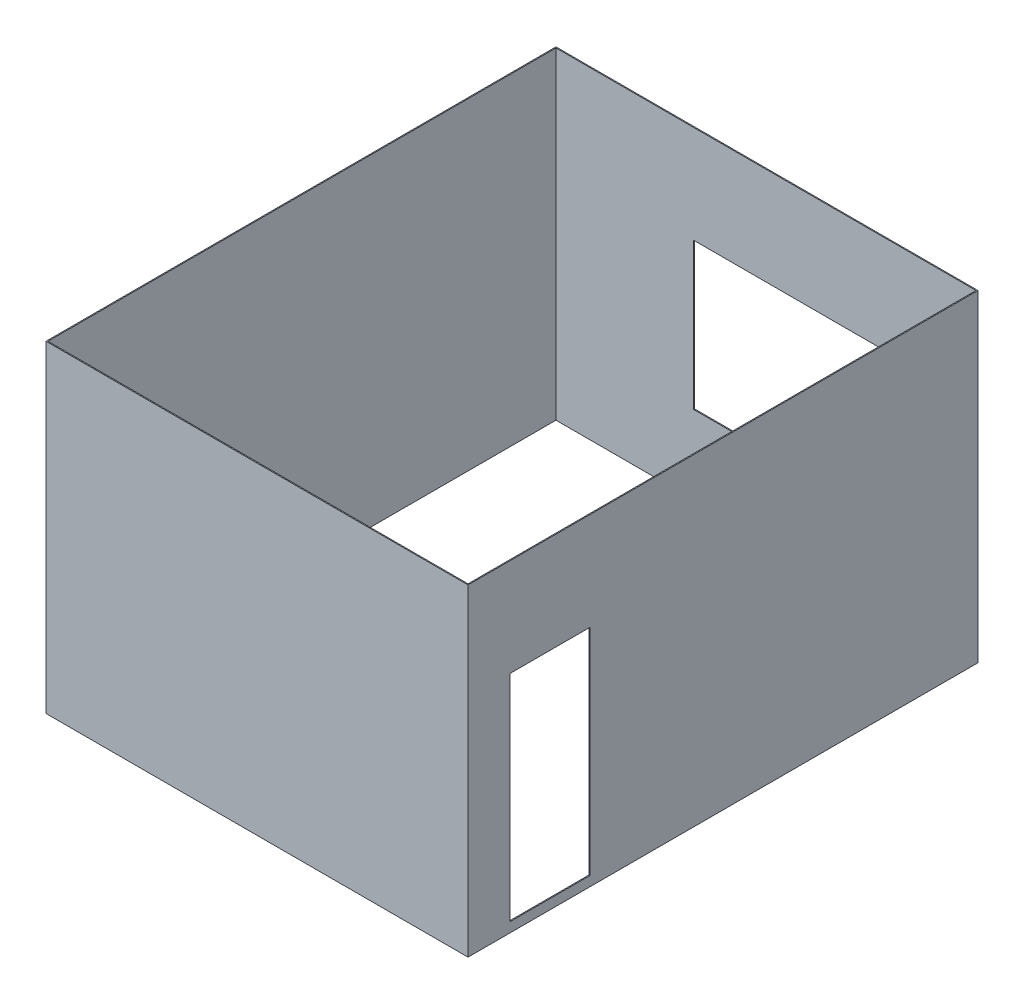
ISO-10303-21;
HEADER;
FILE_DESCRIPTION(('STEP AP214'),'2;1');
FILE_NAME('part.step','',(''),(''),'','','');
FILE_SCHEMA(('AUTOMOTIVE_DESIGN { 1 0 10303 214 1 1 1 1 }'));
ENDSEC;
DATA;
#1=APPLICATION_CONTEXT('core data for automotive mechanical design processes');
#2=APPLICATION_PROTOCOL_DEFINITION('international standard','automotive_design',2000,#1);
#3=PRODUCT_CONTEXT('',#1,'mechanical');
#4=PRODUCT('Part','Part','',(#3));
#5=PRODUCT_RELATED_PRODUCT_CATEGORY('part','',(#4));
#6=PRODUCT_DEFINITION_FORMATION('','',#4);
#7=PRODUCT_DEFINITION_CONTEXT('part definition',#1,'design');
#8=PRODUCT_DEFINITION('design','',#6,#7);
#9=PRODUCT_DEFINITION_SHAPE('','',#8);
#10=(LENGTH_UNIT() NAMED_UNIT(*) SI_UNIT(.MILLI.,.METRE.));
#11=(NAMED_UNIT(*) PLANE_ANGLE_UNIT() SI_UNIT($,.RADIAN.));
#12=(NAMED_UNIT(*) SI_UNIT($,.STERADIAN.) SOLID_ANGLE_UNIT());
#13=UNCERTAINTY_MEASURE_WITH_UNIT(LENGTH_MEASURE(1.E-05),#10,'distance_accuracy_value','');
#14=(GEOMETRIC_REPRESENTATION_CONTEXT(3) GLOBAL_UNCERTAINTY_ASSIGNED_CONTEXT((#13)) GLOBAL_UNIT_ASSIGNED_CONTEXT((#10,
#11,#12)) REPRESENTATION_CONTEXT('',''));
#15=CARTESIAN_POINT('',(0.,0.,0.));
#16=DIRECTION('',(0.,0.,1.));
#17=DIRECTION('',(1.,0.,0.));
#18=AXIS2_PLACEMENT_3D('',#15,#16,#17);
#19=CARTESIAN_POINT('',(0.,330.,0.));
#20=DIRECTION('',(0.,1.,0.));
#21=DIRECTION('',(0.,0.,1.));
#22=AXIS2_PLACEMENT_3D('',#19,#20,#21);
#23=PLANE('',#22);
#24=DIRECTION('',(0.,0.,-1.));
#25=VECTOR('',#24,1.);
#26=CARTESIAN_POINT('',(1.,330.,0.));
#27=LINE('',#26,#25);
#28=CARTESIAN_POINT('',(1.,330.,1.));
#29=VERTEX_POINT('',#28);
#30=CARTESIAN_POINT('',(1.,330.,-521.));
#31=VERTEX_POINT('',#30);
#32=EDGE_CURVE('E251',#29,#31,#27,.T.);
#33=ORIENTED_EDGE('',*,*,#32,.T.);
#34=DIRECTION('',(-1.,0.,0.));
#35=VECTOR('',#34,1.);
#36=CARTESIAN_POINT('',(0.,330.,-521.));
#37=LINE('',#36,#35);
#38=CARTESIAN_POINT('',(-431.,330.,-521.));
#39=VERTEX_POINT('',#38);
#40=EDGE_CURVE('E254',#31,#39,#37,.T.);
#41=ORIENTED_EDGE('',*,*,#40,.T.);
#42=DIRECTION('',(0.,0.,1.));
#43=VECTOR('',#42,1.);
#44=CARTESIAN_POINT('',(-431.,330.,0.));
#45=LINE('',#44,#43);
#46=CARTESIAN_POINT('',(-431.,330.,1.00000000000005));
#47=VERTEX_POINT('',#46);
#48=EDGE_CURVE('E257',#39,#47,#45,.T.);
#49=ORIENTED_EDGE('',*,*,#48,.T.);
#50=DIRECTION('',(1.,0.,0.));
#51=VECTOR('',#50,1.);
#52=CARTESIAN_POINT('',(0.,330.,1.));
#53=LINE('',#52,#51);
#54=EDGE_CURVE('E259',#47,#29,#53,.T.);
#55=ORIENTED_EDGE('',*,*,#54,.T.);
#56=EDGE_LOOP('',(#33,#41,#49,#55));
#57=FACE_BOUND('',#56,.T.);
#58=DIRECTION('',(-1.,0.,0.));
#59=VECTOR('',#58,1.);
#60=CARTESIAN_POINT('',(0.,330.,-520.));
#61=LINE('',#60,#59);
#62=CARTESIAN_POINT('',(0.,330.,-520.));
#63=VERTEX_POINT('',#62);
#64=CARTESIAN_POINT('',(-430.,330.,-520.));
#65=VERTEX_POINT('',#64);
#66=EDGE_CURVE('E222',#63,#65,#61,.T.);
#67=ORIENTED_EDGE('',*,*,#66,.F.);
#68=DIRECTION('',(0.,0.,-1.));
#69=VECTOR('',#68,1.);
#70=CARTESIAN_POINT('',(0.,330.,0.));
#71=LINE('',#70,#69);
#72=CARTESIAN_POINT('',(0.,330.,0.));
#73=VERTEX_POINT('',#72);
#74=EDGE_CURVE('E220',#73,#63,#71,.T.);
#75=ORIENTED_EDGE('',*,*,#74,.F.);
#76=DIRECTION('',(1.,0.,0.));
#77=VECTOR('',#76,1.);
#78=CARTESIAN_POINT('',(0.,330.,0.));
#79=LINE('',#78,#77);
#80=CARTESIAN_POINT('',(-430.,330.,0.));
#81=VERTEX_POINT('',#80);
#82=EDGE_CURVE('E228',#81,#73,#79,.T.);
#83=ORIENTED_EDGE('',*,*,#82,.F.);
#84=DIRECTION('',(0.,0.,1.));
#85=VECTOR('',#84,1.);
#86=CARTESIAN_POINT('',(-430.,330.,0.));
#87=LINE('',#86,#85);
#88=EDGE_CURVE('E225',#65,#81,#87,.T.);
#89=ORIENTED_EDGE('',*,*,#88,.F.);
#90=EDGE_LOOP('',(#67,#75,#83,#89));
#91=FACE_BOUND('',#90,.T.);
#92=ADVANCED_FACE('F59',(#57,#91),#23,.T.);
#93=CARTESIAN_POINT('',(0.,0.,0.));
#94=DIRECTION('',(0.,1.,0.));
#95=DIRECTION('',(0.,0.,1.));
#96=AXIS2_PLACEMENT_3D('',#93,#94,#95);
#97=PLANE('',#96);
#98=DIRECTION('',(0.,0.,-1.));
#99=VECTOR('',#98,1.);
#100=CARTESIAN_POINT('',(1.,0.,0.));
#101=LINE('',#100,#99);
#102=CARTESIAN_POINT('',(1.,0.,1.));
#103=VERTEX_POINT('',#102);
#104=CARTESIAN_POINT('',(1.,0.,-521.));
#105=VERTEX_POINT('',#104);
#106=EDGE_CURVE('E250',#103,#105,#101,.T.);
#107=ORIENTED_EDGE('',*,*,#106,.F.);
#108=DIRECTION('',(1.,0.,0.));
#109=VECTOR('',#108,1.);
#110=CARTESIAN_POINT('',(0.,0.,1.));
#111=LINE('',#110,#109);
#112=CARTESIAN_POINT('',(-431.,0.,1.00000000000005));
#113=VERTEX_POINT('',#112);
#114=EDGE_CURVE('E255',#113,#103,#111,.T.);
#115=ORIENTED_EDGE('',*,*,#114,.F.);
#116=DIRECTION('',(0.,0.,1.));
#117=VECTOR('',#116,1.);
#118=CARTESIAN_POINT('',(-431.,0.,0.));
#119=LINE('',#118,#117);
#120=CARTESIAN_POINT('',(-431.,0.,-521.));
#121=VERTEX_POINT('',#120);
#122=EDGE_CURVE('E266',#121,#113,#119,.T.);
#123=ORIENTED_EDGE('',*,*,#122,.F.);
#124=DIRECTION('',(-1.,0.,0.));
#125=VECTOR('',#124,1.);
#126=CARTESIAN_POINT('',(0.,0.,-521.));
#127=LINE('',#126,#125);
#128=EDGE_CURVE('E264',#105,#121,#127,.T.);
#129=ORIENTED_EDGE('',*,*,#128,.F.);
#130=EDGE_LOOP('',(#107,#115,#123,#129));
#131=FACE_BOUND('',#130,.T.);
#132=DIRECTION('',(0.,0.,-1.));
#133=VECTOR('',#132,1.);
#134=CARTESIAN_POINT('',(0.,0.,0.));
#135=LINE('',#134,#133);
#136=CARTESIAN_POINT('',(0.,0.,0.));
#137=VERTEX_POINT('',#136);
#138=CARTESIAN_POINT('',(0.,0.,-520.));
#139=VERTEX_POINT('',#138);
#140=EDGE_CURVE('E213',#137,#139,#135,.T.);
#141=ORIENTED_EDGE('',*,*,#140,.T.);
#142=DIRECTION('',(-1.,0.,0.));
#143=VECTOR('',#142,1.);
#144=CARTESIAN_POINT('',(0.,0.,-520.));
#145=LINE('',#144,#143);
#146=CARTESIAN_POINT('',(-430.,0.,-520.));
#147=VERTEX_POINT('',#146);
#148=EDGE_CURVE('E233',#139,#147,#145,.T.);
#149=ORIENTED_EDGE('',*,*,#148,.T.);
#150=DIRECTION('',(0.,0.,1.));
#151=VECTOR('',#150,1.);
#152=CARTESIAN_POINT('',(-430.,0.,0.));
#153=LINE('',#152,#151);
#154=CARTESIAN_POINT('',(-430.,0.,0.));
#155=VERTEX_POINT('',#154);
#156=EDGE_CURVE('E236',#147,#155,#153,.T.);
#157=ORIENTED_EDGE('',*,*,#156,.T.);
#158=DIRECTION('',(1.,0.,0.));
#159=VECTOR('',#158,1.);
#160=CARTESIAN_POINT('',(0.,0.,0.));
#161=LINE('',#160,#159);
#162=EDGE_CURVE('E223',#155,#137,#161,.T.);
#163=ORIENTED_EDGE('',*,*,#162,.T.);
#164=EDGE_LOOP('',(#141,#149,#157,#163));
#165=FACE_BOUND('',#164,.T.);
#166=ADVANCED_FACE('F314',(#131,#165),#97,.F.);
#167=CARTESIAN_POINT('',(1.,330.,0.));
#168=DIRECTION('',(-1.,0.,0.));
#169=DIRECTION('',(0.,0.,1.));
#170=AXIS2_PLACEMENT_3D('',#167,#168,#169);
#171=PLANE('',#170);
#172=DIRECTION('',(0.,0.,-1.));
#173=VECTOR('',#172,1.);
#174=CARTESIAN_POINT('',(1.,10.,-42.));
#175=LINE('',#174,#173);
#176=CARTESIAN_POINT('',(1.,10.,-42.));
#177=VERTEX_POINT('',#176);
#178=CARTESIAN_POINT('',(1.,10.,-124.));
#179=VERTEX_POINT('',#178);
#180=EDGE_CURVE('E201',#177,#179,#175,.T.);
#181=ORIENTED_EDGE('',*,*,#180,.F.);
#182=DIRECTION('',(0.,-1.,0.));
#183=VECTOR('',#182,1.);
#184=CARTESIAN_POINT('',(1.,10.,-42.));
#185=LINE('',#184,#183);
#186=CARTESIAN_POINT('',(1.,230.,-42.));
#187=VERTEX_POINT('',#186);
#188=EDGE_CURVE('E197',#187,#177,#185,.T.);
#189=ORIENTED_EDGE('',*,*,#188,.F.);
#190=DIRECTION('',(0.,0.,1.));
#191=VECTOR('',#190,1.);
#192=CARTESIAN_POINT('',(1.,230.,-42.));
#193=LINE('',#192,#191);
#194=CARTESIAN_POINT('',(1.,230.,-124.));
#195=VERTEX_POINT('',#194);
#196=EDGE_CURVE('E207',#195,#187,#193,.T.);
#197=ORIENTED_EDGE('',*,*,#196,.F.);
#198=DIRECTION('',(0.,1.,0.));
#199=VECTOR('',#198,1.);
#200=CARTESIAN_POINT('',(1.,10.,-124.));
#201=LINE('',#200,#199);
#202=EDGE_CURVE('E204',#179,#195,#201,.T.);
#203=ORIENTED_EDGE('',*,*,#202,.F.);
#204=EDGE_LOOP('',(#181,#189,#197,#203));
#205=FACE_BOUND('',#204,.T.);
#206=ORIENTED_EDGE('',*,*,#106,.T.);
#207=DIRECTION('',(0.,-1.,0.));
#208=VECTOR('',#207,1.);
#209=CARTESIAN_POINT('',(1.,330.,-521.));
#210=LINE('',#209,#208);
#211=EDGE_CURVE('E277',#31,#105,#210,.T.);
#212=ORIENTED_EDGE('',*,*,#211,.F.);
#213=ORIENTED_EDGE('',*,*,#32,.F.);
#214=DIRECTION('',(0.,-1.,0.));
#215=VECTOR('',#214,1.);
#216=CARTESIAN_POINT('',(1.,330.,1.));
#217=LINE('',#216,#215);
#218=EDGE_CURVE('E261',#29,#103,#217,.T.);
#219=ORIENTED_EDGE('',*,*,#218,.T.);
#220=EDGE_LOOP('',(#206,#212,#213,#219));
#221=FACE_BOUND('',#220,.T.);
#222=ADVANCED_FACE('F61',(#205,#221),#171,.F.);
#223=CARTESIAN_POINT('',(0.,330.,-521.));
#224=DIRECTION('',(0.,0.,1.));
#225=DIRECTION('',(1.,0.,0.));
#226=AXIS2_PLACEMENT_3D('',#223,#224,#225);
#227=PLANE('',#226);
#228=DIRECTION('',(1.,0.,0.));
#229=VECTOR('',#228,1.);
#230=CARTESIAN_POINT('',(-289.,230.,-521.));
#231=LINE('',#230,#229);
#232=CARTESIAN_POINT('',(-289.,230.,-521.));
#233=VERTEX_POINT('',#232);
#234=CARTESIAN_POINT('',(-89.,230.,-521.));
#235=VERTEX_POINT('',#234);
#236=EDGE_CURVE('E183',#233,#235,#231,.T.);
#237=ORIENTED_EDGE('',*,*,#236,.F.);
#238=DIRECTION('',(0.,1.,0.));
#239=VECTOR('',#238,1.);
#240=CARTESIAN_POINT('',(-289.,80.,-521.));
#241=LINE('',#240,#239);
#242=CARTESIAN_POINT('',(-289.,80.,-521.));
#243=VERTEX_POINT('',#242);
#244=EDGE_CURVE('E74',#243,#233,#241,.T.);
#245=ORIENTED_EDGE('',*,*,#244,.F.);
#246=DIRECTION('',(-1.,0.,0.));
#247=VECTOR('',#246,1.);
#248=CARTESIAN_POINT('',(-289.,80.,-521.));
#249=LINE('',#248,#247);
#250=CARTESIAN_POINT('',(-89.,80.,-521.));
#251=VERTEX_POINT('',#250);
#252=EDGE_CURVE('E190',#251,#243,#249,.T.);
#253=ORIENTED_EDGE('',*,*,#252,.F.);
#254=DIRECTION('',(0.,-1.,0.));
#255=VECTOR('',#254,1.);
#256=CARTESIAN_POINT('',(-89.,80.,-521.));
#257=LINE('',#256,#255);
#258=EDGE_CURVE('E174',#235,#251,#257,.T.);
#259=ORIENTED_EDGE('',*,*,#258,.F.);
#260=EDGE_LOOP('',(#237,#245,#253,#259));
#261=FACE_BOUND('',#260,.T.);
#262=ORIENTED_EDGE('',*,*,#128,.T.);
#263=DIRECTION('',(0.,-1.,0.));
#264=VECTOR('',#263,1.);
#265=CARTESIAN_POINT('',(-431.,330.,-521.));
#266=LINE('',#265,#264);
#267=EDGE_CURVE('E274',#39,#121,#266,.T.);
#268=ORIENTED_EDGE('',*,*,#267,.F.);
#269=ORIENTED_EDGE('',*,*,#40,.F.);
#270=ORIENTED_EDGE('',*,*,#211,.T.);
#271=EDGE_LOOP('',(#262,#268,#269,#270));
#272=FACE_BOUND('',#271,.T.);
#273=ADVANCED_FACE('F187',(#261,#272),#227,.F.);
#274=CARTESIAN_POINT('',(-431.,330.,0.));
#275=DIRECTION('',(1.,0.,0.));
#276=DIRECTION('',(0.,0.,-1.));
#277=AXIS2_PLACEMENT_3D('',#274,#275,#276);
#278=PLANE('',#277);
#279=ORIENTED_EDGE('',*,*,#122,.T.);
#280=DIRECTION('',(0.,-1.,0.));
#281=VECTOR('',#280,1.);
#282=CARTESIAN_POINT('',(-431.,330.,1.00000000000005));
#283=LINE('',#282,#281);
#284=EDGE_CURVE('E271',#47,#113,#283,.T.);
#285=ORIENTED_EDGE('',*,*,#284,.F.);
#286=ORIENTED_EDGE('',*,*,#48,.F.);
#287=ORIENTED_EDGE('',*,*,#267,.T.);
#288=EDGE_LOOP('',(#279,#285,#286,#287));
#289=FACE_BOUND('',#288,.T.);
#290=ADVANCED_FACE('F330',(#289),#278,.F.);
#291=CARTESIAN_POINT('',(0.,330.,1.));
#292=DIRECTION('',(0.,0.,-1.));
#293=DIRECTION('',(-1.,0.,0.));
#294=AXIS2_PLACEMENT_3D('',#291,#292,#293);
#295=PLANE('',#294);
#296=ORIENTED_EDGE('',*,*,#114,.T.);
#297=ORIENTED_EDGE('',*,*,#218,.F.);
#298=ORIENTED_EDGE('',*,*,#54,.F.);
#299=ORIENTED_EDGE('',*,*,#284,.T.);
#300=EDGE_LOOP('',(#296,#297,#298,#299));
#301=FACE_BOUND('',#300,.T.);
#302=ADVANCED_FACE('F327',(#301),#295,.F.);
#303=CARTESIAN_POINT('',(0.,330.,0.));
#304=DIRECTION('',(-1.,0.,0.));
#305=DIRECTION('',(0.,0.,1.));
#306=AXIS2_PLACEMENT_3D('',#303,#304,#305);
#307=PLANE('',#306);
#308=DIRECTION('',(0.,1.,0.));
#309=VECTOR('',#308,1.);
#310=CARTESIAN_POINT('',(0.,330.,-42.));
#311=LINE('',#310,#309);
#312=CARTESIAN_POINT('',(0.,10.,-42.));
#313=VERTEX_POINT('',#312);
#314=CARTESIAN_POINT('',(0.,230.,-42.));
#315=VERTEX_POINT('',#314);
#316=EDGE_CURVE('E287',#313,#315,#311,.T.);
#317=ORIENTED_EDGE('',*,*,#316,.F.);
#318=DIRECTION('',(0.,0.,1.));
#319=VECTOR('',#318,1.);
#320=CARTESIAN_POINT('',(0.,10.,0.));
#321=LINE('',#320,#319);
#322=CARTESIAN_POINT('',(0.,10.,-124.));
#323=VERTEX_POINT('',#322);
#324=EDGE_CURVE('E280',#323,#313,#321,.T.);
#325=ORIENTED_EDGE('',*,*,#324,.F.);
#326=DIRECTION('',(0.,-1.,0.));
#327=VECTOR('',#326,1.);
#328=CARTESIAN_POINT('',(0.,330.,-124.));
#329=LINE('',#328,#327);
#330=CARTESIAN_POINT('',(0.,230.,-124.));
#331=VERTEX_POINT('',#330);
#332=EDGE_CURVE('E282',#331,#323,#329,.T.);
#333=ORIENTED_EDGE('',*,*,#332,.F.);
#334=DIRECTION('',(0.,0.,-1.));
#335=VECTOR('',#334,1.);
#336=CARTESIAN_POINT('',(0.,230.,0.));
#337=LINE('',#336,#335);
#338=EDGE_CURVE('E285',#315,#331,#337,.T.);
#339=ORIENTED_EDGE('',*,*,#338,.F.);
#340=EDGE_LOOP('',(#317,#325,#333,#339));
#341=FACE_BOUND('',#340,.T.);
#342=ORIENTED_EDGE('',*,*,#140,.F.);
#343=DIRECTION('',(0.,-1.,0.));
#344=VECTOR('',#343,1.);
#345=CARTESIAN_POINT('',(0.,330.,0.));
#346=LINE('',#345,#344);
#347=EDGE_CURVE('E230',#73,#137,#346,.T.);
#348=ORIENTED_EDGE('',*,*,#347,.F.);
#349=ORIENTED_EDGE('',*,*,#74,.T.);
#350=DIRECTION('',(0.,-1.,0.));
#351=VECTOR('',#350,1.);
#352=CARTESIAN_POINT('',(0.,330.,-520.));
#353=LINE('',#352,#351);
#354=EDGE_CURVE('E247',#63,#139,#353,.T.);
#355=ORIENTED_EDGE('',*,*,#354,.T.);
#356=EDGE_LOOP('',(#342,#348,#349,#355));
#357=FACE_BOUND('',#356,.T.);
#358=ADVANCED_FACE('F324',(#341,#357),#307,.T.);
#359=CARTESIAN_POINT('',(0.,330.,-520.));
#360=DIRECTION('',(0.,0.,1.));
#361=DIRECTION('',(1.,0.,0.));
#362=AXIS2_PLACEMENT_3D('',#359,#360,#361);
#363=PLANE('',#362);
#364=DIRECTION('',(0.,-1.,0.));
#365=VECTOR('',#364,1.);
#366=CARTESIAN_POINT('',(-289.,330.,-520.));
#367=LINE('',#366,#365);
#368=CARTESIAN_POINT('',(-289.,230.,-520.));
#369=VERTEX_POINT('',#368);
#370=CARTESIAN_POINT('',(-289.,80.,-520.));
#371=VERTEX_POINT('',#370);
#372=EDGE_CURVE('E12',#369,#371,#367,.T.);
#373=ORIENTED_EDGE('',*,*,#372,.F.);
#374=DIRECTION('',(-1.,0.,0.));
#375=VECTOR('',#374,1.);
#376=CARTESIAN_POINT('',(0.,230.,-520.));
#377=LINE('',#376,#375);
#378=CARTESIAN_POINT('',(-89.,230.,-520.));
#379=VERTEX_POINT('',#378);
#380=EDGE_CURVE('E289',#379,#369,#377,.T.);
#381=ORIENTED_EDGE('',*,*,#380,.F.);
#382=DIRECTION('',(0.,1.,0.));
#383=VECTOR('',#382,1.);
#384=CARTESIAN_POINT('',(-89.,330.,-520.));
#385=LINE('',#384,#383);
#386=CARTESIAN_POINT('',(-89.,80.,-520.));
#387=VERTEX_POINT('',#386);
#388=EDGE_CURVE('E177',#387,#379,#385,.T.);
#389=ORIENTED_EDGE('',*,*,#388,.F.);
#390=DIRECTION('',(1.,0.,0.));
#391=VECTOR('',#390,1.);
#392=CARTESIAN_POINT('',(0.,80.,-520.));
#393=LINE('',#392,#391);
#394=EDGE_CURVE('E67',#371,#387,#393,.T.);
#395=ORIENTED_EDGE('',*,*,#394,.F.);
#396=EDGE_LOOP('',(#373,#381,#389,#395));
#397=FACE_BOUND('',#396,.T.);
#398=ORIENTED_EDGE('',*,*,#148,.F.);
#399=ORIENTED_EDGE('',*,*,#354,.F.);
#400=ORIENTED_EDGE('',*,*,#66,.T.);
#401=DIRECTION('',(0.,-1.,0.));
#402=VECTOR('',#401,1.);
#403=CARTESIAN_POINT('',(-430.,330.,-520.));
#404=LINE('',#403,#402);
#405=EDGE_CURVE('E245',#65,#147,#404,.T.);
#406=ORIENTED_EDGE('',*,*,#405,.T.);
#407=EDGE_LOOP('',(#398,#399,#400,#406));
#408=FACE_BOUND('',#407,.T.);
#409=ADVANCED_FACE('F297',(#397,#408),#363,.T.);
#410=CARTESIAN_POINT('',(-430.,330.,0.));
#411=DIRECTION('',(1.,0.,0.));
#412=DIRECTION('',(0.,0.,-1.));
#413=AXIS2_PLACEMENT_3D('',#410,#411,#412);
#414=PLANE('',#413);
#415=ORIENTED_EDGE('',*,*,#156,.F.);
#416=ORIENTED_EDGE('',*,*,#405,.F.);
#417=ORIENTED_EDGE('',*,*,#88,.T.);
#418=DIRECTION('',(0.,-1.,0.));
#419=VECTOR('',#418,1.);
#420=CARTESIAN_POINT('',(-430.,330.,0.));
#421=LINE('',#420,#419);
#422=EDGE_CURVE('E243',#81,#155,#421,.T.);
#423=ORIENTED_EDGE('',*,*,#422,.T.);
#424=EDGE_LOOP('',(#415,#416,#417,#423));
#425=FACE_BOUND('',#424,.T.);
#426=ADVANCED_FACE('F371',(#425),#414,.T.);
#427=CARTESIAN_POINT('',(0.,330.,0.));
#428=DIRECTION('',(0.,0.,-1.));
#429=DIRECTION('',(-1.,0.,0.));
#430=AXIS2_PLACEMENT_3D('',#427,#428,#429);
#431=PLANE('',#430);
#432=ORIENTED_EDGE('',*,*,#162,.F.);
#433=ORIENTED_EDGE('',*,*,#422,.F.);
#434=ORIENTED_EDGE('',*,*,#82,.T.);
#435=ORIENTED_EDGE('',*,*,#347,.T.);
#436=EDGE_LOOP('',(#432,#433,#434,#435));
#437=FACE_BOUND('',#436,.T.);
#438=ADVANCED_FACE('F364',(#437),#431,.T.);
#439=CARTESIAN_POINT('',(-9.,10.,-42.));
#440=DIRECTION('',(0.,0.,1.));
#441=DIRECTION('',(1.,0.,0.));
#442=AXIS2_PLACEMENT_3D('',#439,#440,#441);
#443=PLANE('',#442);
#444=ORIENTED_EDGE('',*,*,#316,.T.);
#445=DIRECTION('',(1.,0.,0.));
#446=VECTOR('',#445,1.);
#447=CARTESIAN_POINT('',(-9.,230.,-42.));
#448=LINE('',#447,#446);
#449=EDGE_CURVE('E211',#315,#187,#448,.T.);
#450=ORIENTED_EDGE('',*,*,#449,.T.);
#451=ORIENTED_EDGE('',*,*,#188,.T.);
#452=DIRECTION('',(1.,0.,0.));
#453=VECTOR('',#452,1.);
#454=CARTESIAN_POINT('',(-9.,10.,-42.));
#455=LINE('',#454,#453);
#456=EDGE_CURVE('E210',#313,#177,#455,.T.);
#457=ORIENTED_EDGE('',*,*,#456,.F.);
#458=EDGE_LOOP('',(#444,#450,#451,#457));
#459=FACE_BOUND('',#458,.T.);
#460=ADVANCED_FACE('F378',(#459),#443,.F.);
#461=CARTESIAN_POINT('',(-9.,230.,-42.));
#462=DIRECTION('',(0.,1.,0.));
#463=DIRECTION('',(0.,0.,1.));
#464=AXIS2_PLACEMENT_3D('',#461,#462,#463);
#465=PLANE('',#464);
#466=ORIENTED_EDGE('',*,*,#338,.T.);
#467=DIRECTION('',(1.,0.,0.));
#468=VECTOR('',#467,1.);
#469=CARTESIAN_POINT('',(-9.,230.,-124.));
#470=LINE('',#469,#468);
#471=EDGE_CURVE('E214',#331,#195,#470,.T.);
#472=ORIENTED_EDGE('',*,*,#471,.T.);
#473=ORIENTED_EDGE('',*,*,#196,.T.);
#474=ORIENTED_EDGE('',*,*,#449,.F.);
#475=EDGE_LOOP('',(#466,#472,#473,#474));
#476=FACE_BOUND('',#475,.T.);
#477=ADVANCED_FACE('F382',(#476),#465,.F.);
#478=CARTESIAN_POINT('',(-9.,10.,-124.));
#479=DIRECTION('',(0.,0.,-1.));
#480=DIRECTION('',(-1.,0.,0.));
#481=AXIS2_PLACEMENT_3D('',#478,#479,#480);
#482=PLANE('',#481);
#483=ORIENTED_EDGE('',*,*,#332,.T.);
#484=DIRECTION('',(1.,0.,0.));
#485=VECTOR('',#484,1.);
#486=CARTESIAN_POINT('',(-9.,10.,-124.));
#487=LINE('',#486,#485);
#488=EDGE_CURVE('E216',#323,#179,#487,.T.);
#489=ORIENTED_EDGE('',*,*,#488,.T.);
#490=ORIENTED_EDGE('',*,*,#202,.T.);
#491=ORIENTED_EDGE('',*,*,#471,.F.);
#492=EDGE_LOOP('',(#483,#489,#490,#491));
#493=FACE_BOUND('',#492,.T.);
#494=ADVANCED_FACE('F308',(#493),#482,.F.);
#495=CARTESIAN_POINT('',(-9.,10.,-42.));
#496=DIRECTION('',(0.,-1.,0.));
#497=DIRECTION('',(0.,0.,-1.));
#498=AXIS2_PLACEMENT_3D('',#495,#496,#497);
#499=PLANE('',#498);
#500=ORIENTED_EDGE('',*,*,#324,.T.);
#501=ORIENTED_EDGE('',*,*,#456,.T.);
#502=ORIENTED_EDGE('',*,*,#180,.T.);
#503=ORIENTED_EDGE('',*,*,#488,.F.);
#504=EDGE_LOOP('',(#500,#501,#502,#503));
#505=FACE_BOUND('',#504,.T.);
#506=ADVANCED_FACE('F301',(#505),#499,.F.);
#507=CARTESIAN_POINT('',(-289.,80.,-511.));
#508=DIRECTION('',(-1.,0.,0.));
#509=DIRECTION('',(0.,-1.,0.));
#510=AXIS2_PLACEMENT_3D('',#507,#508,#509);
#511=PLANE('',#510);
#512=ORIENTED_EDGE('',*,*,#372,.T.);
#513=DIRECTION('',(0.,0.,-1.));
#514=VECTOR('',#513,1.);
#515=CARTESIAN_POINT('',(-289.,80.,-511.));
#516=LINE('',#515,#514);
#517=EDGE_CURVE('E195',#371,#243,#516,.T.);
#518=ORIENTED_EDGE('',*,*,#517,.T.);
#519=ORIENTED_EDGE('',*,*,#244,.T.);
#520=DIRECTION('',(0.,0.,-1.));
#521=VECTOR('',#520,1.);
#522=CARTESIAN_POINT('',(-289.,230.,-511.));
#523=LINE('',#522,#521);
#524=EDGE_CURVE('E180',#369,#233,#523,.T.);
#525=ORIENTED_EDGE('',*,*,#524,.F.);
#526=EDGE_LOOP('',(#512,#518,#519,#525));
#527=FACE_BOUND('',#526,.T.);
#528=ADVANCED_FACE('F299',(#527),#511,.F.);
#529=CARTESIAN_POINT('',(-289.,80.,-511.));
#530=DIRECTION('',(0.,-1.,0.));
#531=DIRECTION('',(1.,0.,0.));
#532=AXIS2_PLACEMENT_3D('',#529,#530,#531);
#533=PLANE('',#532);
#534=ORIENTED_EDGE('',*,*,#394,.T.);
#535=DIRECTION('',(0.,0.,-1.));
#536=VECTOR('',#535,1.);
#537=CARTESIAN_POINT('',(-89.,80.,-511.));
#538=LINE('',#537,#536);
#539=EDGE_CURVE('E179',#387,#251,#538,.T.);
#540=ORIENTED_EDGE('',*,*,#539,.T.);
#541=ORIENTED_EDGE('',*,*,#252,.T.);
#542=ORIENTED_EDGE('',*,*,#517,.F.);
#543=EDGE_LOOP('',(#534,#540,#541,#542));
#544=FACE_BOUND('',#543,.T.);
#545=ADVANCED_FACE('F294',(#544),#533,.F.);
#546=CARTESIAN_POINT('',(-89.,80.,-511.));
#547=DIRECTION('',(1.,0.,0.));
#548=DIRECTION('',(0.,0.,-1.));
#549=AXIS2_PLACEMENT_3D('',#546,#547,#548);
#550=PLANE('',#549);
#551=ORIENTED_EDGE('',*,*,#388,.T.);
#552=DIRECTION('',(0.,0.,-1.));
#553=VECTOR('',#552,1.);
#554=CARTESIAN_POINT('',(-89.,230.,-511.));
#555=LINE('',#554,#553);
#556=EDGE_CURVE('E82',#379,#235,#555,.T.);
#557=ORIENTED_EDGE('',*,*,#556,.T.);
#558=ORIENTED_EDGE('',*,*,#258,.T.);
#559=ORIENTED_EDGE('',*,*,#539,.F.);
#560=EDGE_LOOP('',(#551,#557,#558,#559));
#561=FACE_BOUND('',#560,.T.);
#562=ADVANCED_FACE('F171',(#561),#550,.F.);
#563=CARTESIAN_POINT('',(-289.,230.,-511.));
#564=DIRECTION('',(0.,1.,0.));
#565=DIRECTION('',(-1.,0.,0.));
#566=AXIS2_PLACEMENT_3D('',#563,#564,#565);
#567=PLANE('',#566);
#568=ORIENTED_EDGE('',*,*,#380,.T.);
#569=ORIENTED_EDGE('',*,*,#524,.T.);
#570=ORIENTED_EDGE('',*,*,#236,.T.);
#571=ORIENTED_EDGE('',*,*,#556,.F.);
#572=EDGE_LOOP('',(#568,#569,#570,#571));
#573=FACE_BOUND('',#572,.T.);
#574=ADVANCED_FACE('F184',(#573),#567,.F.);
#575=CLOSED_SHELL('',(#92,#166,#222,#273,#290,#302,#358,#409,#426,#438,#460,#477,#494,#506,#528,
#545,#562,#574));
#576=MANIFOLD_SOLID_BREP('B2',#575);
#577=ADVANCED_BREP_SHAPE_REPRESENTATION('',(#18,#576),#14);
#578=SHAPE_DEFINITION_REPRESENTATION(#9,#577);
ENDSEC;
END-ISO-10303-21;
